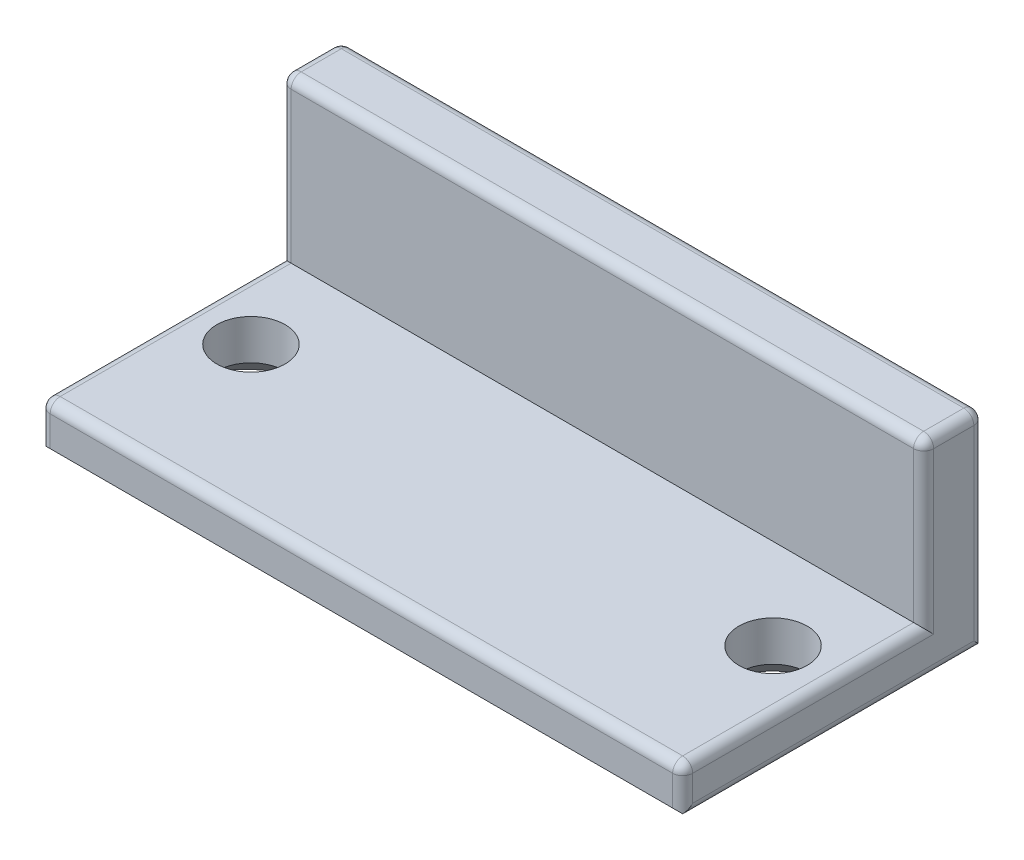
ISO-10303-21;
HEADER;
FILE_DESCRIPTION(('STEP AP214'),'2;1');
FILE_NAME('part.step','',(''),(''),'','','');
FILE_SCHEMA(('AUTOMOTIVE_DESIGN { 1 0 10303 214 1 1 1 1 }'));
ENDSEC;
DATA;
#1=APPLICATION_CONTEXT('core data for automotive mechanical design processes');
#2=APPLICATION_PROTOCOL_DEFINITION('international standard','automotive_design',2000,#1);
#3=PRODUCT_CONTEXT('',#1,'mechanical');
#4=PRODUCT('Part','Part','',(#3));
#5=PRODUCT_RELATED_PRODUCT_CATEGORY('part','',(#4));
#6=PRODUCT_DEFINITION_FORMATION('','',#4);
#7=PRODUCT_DEFINITION_CONTEXT('part definition',#1,'design');
#8=PRODUCT_DEFINITION('design','',#6,#7);
#9=PRODUCT_DEFINITION_SHAPE('','',#8);
#10=(LENGTH_UNIT() NAMED_UNIT(*) SI_UNIT(.MILLI.,.METRE.));
#11=(NAMED_UNIT(*) PLANE_ANGLE_UNIT() SI_UNIT($,.RADIAN.));
#12=(NAMED_UNIT(*) SI_UNIT($,.STERADIAN.) SOLID_ANGLE_UNIT());
#13=UNCERTAINTY_MEASURE_WITH_UNIT(LENGTH_MEASURE(1.E-05),#10,'distance_accuracy_value','');
#14=(GEOMETRIC_REPRESENTATION_CONTEXT(3) GLOBAL_UNCERTAINTY_ASSIGNED_CONTEXT((#13)) GLOBAL_UNIT_ASSIGNED_CONTEXT((#10,
#11,#12)) REPRESENTATION_CONTEXT('',''));
#15=CARTESIAN_POINT('',(0.,0.,0.));
#16=DIRECTION('',(0.,0.,1.));
#17=DIRECTION('',(1.,0.,0.));
#18=AXIS2_PLACEMENT_3D('',#15,#16,#17);
#19=CARTESIAN_POINT('',(0.,3.,0.));
#20=DIRECTION('',(0.,-1.,0.));
#21=DIRECTION('',(0.,0.,-1.));
#22=AXIS2_PLACEMENT_3D('',#19,#20,#21);
#23=PLANE('',#22);
#24=CARTESIAN_POINT('',(13.,3.,0.));
#25=DIRECTION('',(0.,-1.,0.));
#26=DIRECTION('',(0.,0.,-1.));
#27=AXIS2_PLACEMENT_3D('',#24,#25,#26);
#28=CIRCLE('',#27,1.7);
#29=CARTESIAN_POINT('',(13.,3.,-1.7));
#30=VERTEX_POINT('',#29);
#31=EDGE_CURVE('E544',#30,#30,#28,.T.);
#32=ORIENTED_EDGE('',*,*,#31,.T.);
#33=EDGE_LOOP('',(#32));
#34=FACE_BOUND('',#33,.T.);
#35=CARTESIAN_POINT('',(-13.,3.,0.));
#36=DIRECTION('',(0.,-1.,0.));
#37=DIRECTION('',(0.,0.,-1.));
#38=AXIS2_PLACEMENT_3D('',#35,#36,#37);
#39=CIRCLE('',#38,1.7);
#40=CARTESIAN_POINT('',(-13.,3.,-1.7));
#41=VERTEX_POINT('',#40);
#42=EDGE_CURVE('E311',#41,#41,#39,.T.);
#43=ORIENTED_EDGE('',*,*,#42,.T.);
#44=EDGE_LOOP('',(#43));
#45=FACE_BOUND('',#44,.T.);
#46=DIRECTION('',(0.,0.,1.));
#47=VECTOR('',#46,1.);
#48=CARTESIAN_POINT('',(-15.5,3.,0.));
#49=LINE('',#48,#47);
#50=CARTESIAN_POINT('',(-15.5,3.,-4.5));
#51=VERTEX_POINT('',#50);
#52=CARTESIAN_POINT('',(-15.5,3.,7.));
#53=VERTEX_POINT('',#52);
#54=EDGE_CURVE('E345',#51,#53,#49,.T.);
#55=ORIENTED_EDGE('',*,*,#54,.T.);
#56=DIRECTION('',(1.,0.,0.));
#57=VECTOR('',#56,1.);
#58=CARTESIAN_POINT('',(0.,3.,7.));
#59=LINE('',#58,#57);
#60=CARTESIAN_POINT('',(15.5,3.,7.));
#61=VERTEX_POINT('',#60);
#62=EDGE_CURVE('E52',#53,#61,#59,.T.);
#63=ORIENTED_EDGE('',*,*,#62,.T.);
#64=DIRECTION('',(0.,0.,-1.));
#65=VECTOR('',#64,1.);
#66=CARTESIAN_POINT('',(15.5,3.,0.));
#67=LINE('',#66,#65);
#68=CARTESIAN_POINT('',(15.5,3.,-4.5));
#69=VERTEX_POINT('',#68);
#70=EDGE_CURVE('E342',#61,#69,#67,.T.);
#71=ORIENTED_EDGE('',*,*,#70,.T.);
#72=DIRECTION('',(1.,0.,0.));
#73=VECTOR('',#72,1.);
#74=CARTESIAN_POINT('',(-16.,3.,-4.5));
#75=LINE('',#74,#73);
#76=EDGE_CURVE('E216',#51,#69,#75,.T.);
#77=ORIENTED_EDGE('',*,*,#76,.F.);
#78=EDGE_LOOP('',(#55,#63,#71,#77));
#79=FACE_BOUND('',#78,.T.);
#80=ADVANCED_FACE('F42',(#34,#45,#79),#23,.F.);
#81=CARTESIAN_POINT('',(16.,3.,7.5));
#82=DIRECTION('',(-1.,0.,0.));
#83=DIRECTION('',(0.,0.,1.));
#84=AXIS2_PLACEMENT_3D('',#81,#82,#83);
#85=PLANE('',#84);
#86=DIRECTION('',(0.,-1.,0.));
#87=VECTOR('',#86,1.);
#88=CARTESIAN_POINT('',(16.,3.,-5.));
#89=LINE('',#88,#87);
#90=CARTESIAN_POINT('',(16.,10.5,-5.));
#91=VERTEX_POINT('',#90);
#92=CARTESIAN_POINT('',(16.,2.5,-5.));
#93=VERTEX_POINT('',#92);
#94=EDGE_CURVE('E403',#91,#93,#89,.T.);
#95=ORIENTED_EDGE('',*,*,#94,.T.);
#96=DIRECTION('',(0.,0.,-1.));
#97=VECTOR('',#96,1.);
#98=CARTESIAN_POINT('',(16.,2.5,7.5));
#99=LINE('',#98,#97);
#100=CARTESIAN_POINT('',(16.,2.5,7.));
#101=VERTEX_POINT('',#100);
#102=EDGE_CURVE('E406',#93,#101,#99,.F.);
#103=ORIENTED_EDGE('',*,*,#102,.T.);
#104=DIRECTION('',(0.,-1.,0.));
#105=VECTOR('',#104,1.);
#106=CARTESIAN_POINT('',(16.,3.,7.));
#107=LINE('',#106,#105);
#108=CARTESIAN_POINT('',(16.,1.20710678118655,7.));
#109=VERTEX_POINT('',#108);
#110=EDGE_CURVE('E391',#101,#109,#107,.T.);
#111=ORIENTED_EDGE('',*,*,#110,.T.);
#112=DIRECTION('',(0.,0.,-1.));
#113=VECTOR('',#112,1.);
#114=CARTESIAN_POINT('',(16.,1.20710678118655,-7.5));
#115=LINE('',#114,#113);
#116=CARTESIAN_POINT('',(16.,1.20710678118655,-7.));
#117=VERTEX_POINT('',#116);
#118=EDGE_CURVE('E394',#109,#117,#115,.T.);
#119=ORIENTED_EDGE('',*,*,#118,.T.);
#120=DIRECTION('',(0.,-1.,0.));
#121=VECTOR('',#120,1.);
#122=CARTESIAN_POINT('',(16.,3.,-7.));
#123=LINE('',#122,#121);
#124=CARTESIAN_POINT('',(16.,10.5,-7.));
#125=VERTEX_POINT('',#124);
#126=EDGE_CURVE('E397',#117,#125,#123,.F.);
#127=ORIENTED_EDGE('',*,*,#126,.T.);
#128=DIRECTION('',(0.,0.,-1.));
#129=VECTOR('',#128,1.);
#130=CARTESIAN_POINT('',(16.,10.5,-4.5));
#131=LINE('',#130,#129);
#132=EDGE_CURVE('E400',#125,#91,#131,.F.);
#133=ORIENTED_EDGE('',*,*,#132,.T.);
#134=EDGE_LOOP('',(#95,#103,#111,#119,#127,#133));
#135=FACE_BOUND('',#134,.T.);
#136=ADVANCED_FACE('F518',(#135),#85,.F.);
#137=CARTESIAN_POINT('',(-16.,3.,-7.5));
#138=DIRECTION('',(0.,0.,1.));
#139=DIRECTION('',(1.,0.,0.));
#140=AXIS2_PLACEMENT_3D('',#137,#138,#139);
#141=PLANE('',#140);
#142=DIRECTION('',(-1.,0.,0.));
#143=VECTOR('',#142,1.);
#144=CARTESIAN_POINT('',(-16.,1.,-7.5));
#145=LINE('',#144,#143);
#146=CARTESIAN_POINT('',(15.5,1.,-7.5));
#147=VERTEX_POINT('',#146);
#148=CARTESIAN_POINT('',(-15.5,1.,-7.5));
#149=VERTEX_POINT('',#148);
#150=EDGE_CURVE('E212',#147,#149,#145,.T.);
#151=ORIENTED_EDGE('',*,*,#150,.T.);
#152=DIRECTION('',(0.,-1.,0.));
#153=VECTOR('',#152,1.);
#154=CARTESIAN_POINT('',(-15.5,3.,-7.5));
#155=LINE('',#154,#153);
#156=CARTESIAN_POINT('',(-15.5,10.5,-7.5));
#157=VERTEX_POINT('',#156);
#158=EDGE_CURVE('E375',#149,#157,#155,.F.);
#159=ORIENTED_EDGE('',*,*,#158,.T.);
#160=DIRECTION('',(-1.,0.,0.));
#161=VECTOR('',#160,1.);
#162=CARTESIAN_POINT('',(16.,10.5,-7.5));
#163=LINE('',#162,#161);
#164=CARTESIAN_POINT('',(15.5,10.5,-7.5));
#165=VERTEX_POINT('',#164);
#166=EDGE_CURVE('E372',#157,#165,#163,.F.);
#167=ORIENTED_EDGE('',*,*,#166,.T.);
#168=DIRECTION('',(0.,-1.,0.));
#169=VECTOR('',#168,1.);
#170=CARTESIAN_POINT('',(15.5,3.,-7.5));
#171=LINE('',#170,#169);
#172=EDGE_CURVE('E369',#165,#147,#171,.T.);
#173=ORIENTED_EDGE('',*,*,#172,.T.);
#174=EDGE_LOOP('',(#151,#159,#167,#173));
#175=FACE_BOUND('',#174,.T.);
#176=ADVANCED_FACE('F576',(#175),#141,.F.);
#177=CARTESIAN_POINT('',(-16.,3.,7.5));
#178=DIRECTION('',(1.,0.,0.));
#179=DIRECTION('',(0.,0.,-1.));
#180=AXIS2_PLACEMENT_3D('',#177,#178,#179);
#181=PLANE('',#180);
#182=DIRECTION('',(0.,0.,1.));
#183=VECTOR('',#182,1.);
#184=CARTESIAN_POINT('',(-16.,2.5,7.5));
#185=LINE('',#184,#183);
#186=CARTESIAN_POINT('',(-16.,2.5,7.));
#187=VERTEX_POINT('',#186);
#188=CARTESIAN_POINT('',(-16.,2.5,-5.));
#189=VERTEX_POINT('',#188);
#190=EDGE_CURVE('E335',#187,#189,#185,.F.);
#191=ORIENTED_EDGE('',*,*,#190,.T.);
#192=DIRECTION('',(0.,-1.,0.));
#193=VECTOR('',#192,1.);
#194=CARTESIAN_POINT('',(-16.,3.,-5.));
#195=LINE('',#194,#193);
#196=CARTESIAN_POINT('',(-16.,10.5,-5.));
#197=VERTEX_POINT('',#196);
#198=EDGE_CURVE('E338',#189,#197,#195,.F.);
#199=ORIENTED_EDGE('',*,*,#198,.T.);
#200=DIRECTION('',(0.,0.,1.));
#201=VECTOR('',#200,1.);
#202=CARTESIAN_POINT('',(-16.,10.5,-7.5));
#203=LINE('',#202,#201);
#204=CARTESIAN_POINT('',(-16.,10.5,-7.));
#205=VERTEX_POINT('',#204);
#206=EDGE_CURVE('E322',#197,#205,#203,.F.);
#207=ORIENTED_EDGE('',*,*,#206,.T.);
#208=DIRECTION('',(0.,-1.,0.));
#209=VECTOR('',#208,1.);
#210=CARTESIAN_POINT('',(-16.,3.,-7.));
#211=LINE('',#210,#209);
#212=CARTESIAN_POINT('',(-16.,1.20710678118655,-7.));
#213=VERTEX_POINT('',#212);
#214=EDGE_CURVE('E325',#205,#213,#211,.T.);
#215=ORIENTED_EDGE('',*,*,#214,.T.);
#216=DIRECTION('',(0.,0.,1.));
#217=VECTOR('',#216,1.);
#218=CARTESIAN_POINT('',(-16.,1.20710678118655,7.5));
#219=LINE('',#218,#217);
#220=CARTESIAN_POINT('',(-16.,1.20710678118655,7.));
#221=VERTEX_POINT('',#220);
#222=EDGE_CURVE('E328',#213,#221,#219,.T.);
#223=ORIENTED_EDGE('',*,*,#222,.T.);
#224=DIRECTION('',(0.,-1.,0.));
#225=VECTOR('',#224,1.);
#226=CARTESIAN_POINT('',(-16.,3.,7.));
#227=LINE('',#226,#225);
#228=EDGE_CURVE('E331',#221,#187,#227,.F.);
#229=ORIENTED_EDGE('',*,*,#228,.T.);
#230=EDGE_LOOP('',(#191,#199,#207,#215,#223,#229));
#231=FACE_BOUND('',#230,.T.);
#232=ADVANCED_FACE('F585',(#231),#181,.F.);
#233=CARTESIAN_POINT('',(-16.,3.,7.5));
#234=DIRECTION('',(0.,0.,-1.));
#235=DIRECTION('',(-1.,0.,0.));
#236=AXIS2_PLACEMENT_3D('',#233,#234,#235);
#237=PLANE('',#236);
#238=DIRECTION('',(0.,-1.,0.));
#239=VECTOR('',#238,1.);
#240=CARTESIAN_POINT('',(15.5,3.,7.5));
#241=LINE('',#240,#239);
#242=CARTESIAN_POINT('',(15.5,1.,7.5));
#243=VERTEX_POINT('',#242);
#244=CARTESIAN_POINT('',(15.5,2.5,7.5));
#245=VERTEX_POINT('',#244);
#246=EDGE_CURVE('E348',#243,#245,#241,.F.);
#247=ORIENTED_EDGE('',*,*,#246,.T.);
#248=DIRECTION('',(1.,0.,0.));
#249=VECTOR('',#248,1.);
#250=CARTESIAN_POINT('',(-16.,2.5,7.5));
#251=LINE('',#250,#249);
#252=CARTESIAN_POINT('',(-15.5,2.5,7.5));
#253=VERTEX_POINT('',#252);
#254=EDGE_CURVE('E11',#245,#253,#251,.F.);
#255=ORIENTED_EDGE('',*,*,#254,.T.);
#256=DIRECTION('',(0.,-1.,0.));
#257=VECTOR('',#256,1.);
#258=CARTESIAN_POINT('',(-15.5,3.,7.5));
#259=LINE('',#258,#257);
#260=CARTESIAN_POINT('',(-15.5,1.,7.5));
#261=VERTEX_POINT('',#260);
#262=EDGE_CURVE('E351',#253,#261,#259,.T.);
#263=ORIENTED_EDGE('',*,*,#262,.T.);
#264=DIRECTION('',(1.,0.,0.));
#265=VECTOR('',#264,1.);
#266=CARTESIAN_POINT('',(16.,1.,7.5));
#267=LINE('',#266,#265);
#268=EDGE_CURVE('E242',#261,#243,#267,.T.);
#269=ORIENTED_EDGE('',*,*,#268,.T.);
#270=EDGE_LOOP('',(#247,#255,#263,#269));
#271=FACE_BOUND('',#270,.T.);
#272=ADVANCED_FACE('F582',(#271),#237,.F.);
#273=CARTESIAN_POINT('',(0.,0.,0.));
#274=DIRECTION('',(0.,-1.,0.));
#275=DIRECTION('',(0.,0.,-1.));
#276=AXIS2_PLACEMENT_3D('',#273,#274,#275);
#277=PLANE('',#276);
#278=CARTESIAN_POINT('',(-13.,0.,0.));
#279=DIRECTION('',(0.,-1.,0.));
#280=DIRECTION('',(0.,0.,-1.));
#281=AXIS2_PLACEMENT_3D('',#278,#279,#280);
#282=CIRCLE('',#281,2.7);
#283=CARTESIAN_POINT('',(-15.,0.,1.8138357147217));
#284=VERTEX_POINT('',#283);
#285=CARTESIAN_POINT('',(-13.,0.,2.69999999999999));
#286=VERTEX_POINT('',#285);
#287=EDGE_CURVE('E233',#284,#286,#282,.F.);
#288=ORIENTED_EDGE('',*,*,#287,.T.);
#289=CARTESIAN_POINT('',(-13.,0.,0.));
#290=DIRECTION('',(0.,-1.,0.));
#291=DIRECTION('',(0.,0.,-1.));
#292=AXIS2_PLACEMENT_3D('',#289,#290,#291);
#293=CIRCLE('',#292,2.7);
#294=CARTESIAN_POINT('',(-15.,0.,-1.81383571472171));
#295=VERTEX_POINT('',#294);
#296=EDGE_CURVE('E239',#286,#295,#293,.F.);
#297=ORIENTED_EDGE('',*,*,#296,.T.);
#298=DIRECTION('',(0.,0.,-1.));
#299=VECTOR('',#298,1.);
#300=CARTESIAN_POINT('',(-15.,0.,-7.5));
#301=LINE('',#300,#299);
#302=CARTESIAN_POINT('',(-15.,0.,-6.5));
#303=VERTEX_POINT('',#302);
#304=EDGE_CURVE('E236',#295,#303,#301,.T.);
#305=ORIENTED_EDGE('',*,*,#304,.T.);
#306=DIRECTION('',(1.,0.,0.));
#307=VECTOR('',#306,1.);
#308=CARTESIAN_POINT('',(16.,0.,-6.5));
#309=LINE('',#308,#307);
#310=CARTESIAN_POINT('',(15.,0.,-6.5));
#311=VERTEX_POINT('',#310);
#312=EDGE_CURVE('E230',#303,#311,#309,.T.);
#313=ORIENTED_EDGE('',*,*,#312,.T.);
#314=DIRECTION('',(0.,0.,1.));
#315=VECTOR('',#314,1.);
#316=CARTESIAN_POINT('',(15.,0.,7.5));
#317=LINE('',#316,#315);
#318=CARTESIAN_POINT('',(15.,0.,-1.81383571472172));
#319=VERTEX_POINT('',#318);
#320=EDGE_CURVE('E202',#311,#319,#317,.T.);
#321=ORIENTED_EDGE('',*,*,#320,.T.);
#322=CARTESIAN_POINT('',(13.,0.,0.));
#323=DIRECTION('',(0.,-1.,0.));
#324=DIRECTION('',(0.,0.,-1.));
#325=AXIS2_PLACEMENT_3D('',#322,#323,#324);
#326=CIRCLE('',#325,2.7);
#327=CARTESIAN_POINT('',(13.,0.,-2.7));
#328=VERTEX_POINT('',#327);
#329=EDGE_CURVE('E194',#319,#328,#326,.F.);
#330=ORIENTED_EDGE('',*,*,#329,.T.);
#331=CARTESIAN_POINT('',(13.,0.,0.));
#332=DIRECTION('',(0.,-1.,0.));
#333=DIRECTION('',(0.,0.,-1.));
#334=AXIS2_PLACEMENT_3D('',#331,#332,#333);
#335=CIRCLE('',#334,2.7);
#336=CARTESIAN_POINT('',(15.,0.,1.81383571472172));
#337=VERTEX_POINT('',#336);
#338=EDGE_CURVE('E198',#328,#337,#335,.F.);
#339=ORIENTED_EDGE('',*,*,#338,.T.);
#340=DIRECTION('',(0.,0.,1.));
#341=VECTOR('',#340,1.);
#342=CARTESIAN_POINT('',(15.,0.,7.5));
#343=LINE('',#342,#341);
#344=CARTESIAN_POINT('',(15.,0.,6.5));
#345=VERTEX_POINT('',#344);
#346=EDGE_CURVE('E206',#337,#345,#343,.T.);
#347=ORIENTED_EDGE('',*,*,#346,.T.);
#348=DIRECTION('',(-1.,0.,0.));
#349=VECTOR('',#348,1.);
#350=CARTESIAN_POINT('',(-16.,0.,6.5));
#351=LINE('',#350,#349);
#352=CARTESIAN_POINT('',(-15.,0.,6.5));
#353=VERTEX_POINT('',#352);
#354=EDGE_CURVE('E224',#345,#353,#351,.T.);
#355=ORIENTED_EDGE('',*,*,#354,.T.);
#356=DIRECTION('',(0.,0.,-1.));
#357=VECTOR('',#356,1.);
#358=CARTESIAN_POINT('',(-15.,0.,-7.5));
#359=LINE('',#358,#357);
#360=EDGE_CURVE('E227',#353,#284,#359,.T.);
#361=ORIENTED_EDGE('',*,*,#360,.T.);
#362=EDGE_LOOP('',(#288,#297,#305,#313,#321,#330,#339,#347,#355,#361));
#363=FACE_BOUND('',#362,.T.);
#364=ADVANCED_FACE('F196',(#363),#277,.T.);
#365=CARTESIAN_POINT('',(-16.,11.,-4.5));
#366=DIRECTION('',(0.,0.,-1.));
#367=DIRECTION('',(-1.,0.,0.));
#368=AXIS2_PLACEMENT_3D('',#365,#366,#367);
#369=PLANE('',#368);
#370=DIRECTION('',(1.,0.,0.));
#371=VECTOR('',#370,1.);
#372=CARTESIAN_POINT('',(-16.,10.5,-4.5));
#373=LINE('',#372,#371);
#374=CARTESIAN_POINT('',(15.5,10.5,-4.5));
#375=VERTEX_POINT('',#374);
#376=CARTESIAN_POINT('',(-15.5,10.5,-4.5));
#377=VERTEX_POINT('',#376);
#378=EDGE_CURVE('E315',#375,#377,#373,.F.);
#379=ORIENTED_EDGE('',*,*,#378,.T.);
#380=DIRECTION('',(0.,-1.,0.));
#381=VECTOR('',#380,1.);
#382=CARTESIAN_POINT('',(-15.5,11.,-4.5));
#383=LINE('',#382,#381);
#384=EDGE_CURVE('E318',#377,#51,#383,.T.);
#385=ORIENTED_EDGE('',*,*,#384,.T.);
#386=ORIENTED_EDGE('',*,*,#76,.T.);
#387=DIRECTION('',(0.,-1.,0.));
#388=VECTOR('',#387,1.);
#389=CARTESIAN_POINT('',(15.5,11.,-4.5));
#390=LINE('',#389,#388);
#391=EDGE_CURVE('E254',#69,#375,#390,.F.);
#392=ORIENTED_EDGE('',*,*,#391,.T.);
#393=EDGE_LOOP('',(#379,#385,#386,#392));
#394=FACE_BOUND('',#393,.T.);
#395=ADVANCED_FACE('F539',(#394),#369,.F.);
#396=CARTESIAN_POINT('',(0.,11.,0.));
#397=DIRECTION('',(0.,1.,0.));
#398=DIRECTION('',(0.,0.,1.));
#399=AXIS2_PLACEMENT_3D('',#396,#397,#398);
#400=PLANE('',#399);
#401=DIRECTION('',(-1.,0.,0.));
#402=VECTOR('',#401,1.);
#403=CARTESIAN_POINT('',(-16.,11.,-7.));
#404=LINE('',#403,#402);
#405=CARTESIAN_POINT('',(15.5,11.,-7.));
#406=VERTEX_POINT('',#405);
#407=CARTESIAN_POINT('',(-15.5,11.,-7.));
#408=VERTEX_POINT('',#407);
#409=EDGE_CURVE('E384',#406,#408,#404,.T.);
#410=ORIENTED_EDGE('',*,*,#409,.T.);
#411=DIRECTION('',(0.,0.,1.));
#412=VECTOR('',#411,1.);
#413=CARTESIAN_POINT('',(-15.5,11.,-4.5));
#414=LINE('',#413,#412);
#415=CARTESIAN_POINT('',(-15.5,11.,-5.));
#416=VERTEX_POINT('',#415);
#417=EDGE_CURVE('E388',#408,#416,#414,.T.);
#418=ORIENTED_EDGE('',*,*,#417,.T.);
#419=DIRECTION('',(1.,0.,0.));
#420=VECTOR('',#419,1.);
#421=CARTESIAN_POINT('',(16.,11.,-5.));
#422=LINE('',#421,#420);
#423=CARTESIAN_POINT('',(15.5,11.,-5.));
#424=VERTEX_POINT('',#423);
#425=EDGE_CURVE('E381',#416,#424,#422,.T.);
#426=ORIENTED_EDGE('',*,*,#425,.T.);
#427=DIRECTION('',(0.,0.,-1.));
#428=VECTOR('',#427,1.);
#429=CARTESIAN_POINT('',(15.5,11.,-7.5));
#430=LINE('',#429,#428);
#431=EDGE_CURVE('E378',#424,#406,#430,.T.);
#432=ORIENTED_EDGE('',*,*,#431,.T.);
#433=EDGE_LOOP('',(#410,#418,#426,#432));
#434=FACE_BOUND('',#433,.T.);
#435=ADVANCED_FACE('F557',(#434),#400,.T.);
#436=CARTESIAN_POINT('',(-13.,8.,0.));
#437=DIRECTION('',(0.,-1.,0.));
#438=DIRECTION('',(0.,0.,-1.));
#439=AXIS2_PLACEMENT_3D('',#436,#437,#438);
#440=CYLINDRICAL_SURFACE('',#439,1.7);
#441=CARTESIAN_POINT('',(-13.,0.999999999999994,0.));
#442=DIRECTION('',(0.,-1.,0.));
#443=DIRECTION('',(0.,0.,-1.));
#444=AXIS2_PLACEMENT_3D('',#441,#442,#443);
#445=CIRCLE('',#444,1.7);
#446=CARTESIAN_POINT('',(-13.,0.999999999999994,-1.7));
#447=VERTEX_POINT('',#446);
#448=EDGE_CURVE('E246',#447,#447,#445,.T.);
#449=ORIENTED_EDGE('',*,*,#448,.T.);
#450=EDGE_LOOP('',(#449));
#451=FACE_BOUND('',#450,.T.);
#452=ORIENTED_EDGE('',*,*,#42,.F.);
#453=EDGE_LOOP('',(#452));
#454=FACE_BOUND('',#453,.T.);
#455=ADVANCED_FACE('F554',(#451,#454),#440,.F.);
#456=CARTESIAN_POINT('',(13.,8.,0.));
#457=DIRECTION('',(0.,-1.,0.));
#458=DIRECTION('',(0.,0.,-1.));
#459=AXIS2_PLACEMENT_3D('',#456,#457,#458);
#460=CYLINDRICAL_SURFACE('',#459,1.7);
#461=CARTESIAN_POINT('',(13.,1.,0.));
#462=DIRECTION('',(0.,-1.,0.));
#463=DIRECTION('',(0.,0.,-1.));
#464=AXIS2_PLACEMENT_3D('',#461,#462,#463);
#465=CIRCLE('',#464,1.7);
#466=CARTESIAN_POINT('',(13.,1.,-1.7));
#467=VERTEX_POINT('',#466);
#468=EDGE_CURVE('E250',#467,#467,#465,.T.);
#469=ORIENTED_EDGE('',*,*,#468,.T.);
#470=EDGE_LOOP('',(#469));
#471=FACE_BOUND('',#470,.T.);
#472=ORIENTED_EDGE('',*,*,#31,.F.);
#473=EDGE_LOOP('',(#472));
#474=FACE_BOUND('',#473,.T.);
#475=ADVANCED_FACE('F556',(#471,#474),#460,.F.);
#476=CARTESIAN_POINT('',(13.,1.,0.));
#477=DIRECTION('',(0.,-1.,0.));
#478=DIRECTION('',(0.,0.,-1.));
#479=AXIS2_PLACEMENT_3D('',#476,#477,#478);
#480=CONICAL_SURFACE('',#479,1.7,0.78539816339745);
#481=ORIENTED_EDGE('',*,*,#468,.F.);
#482=EDGE_LOOP('',(#481));
#483=FACE_BOUND('',#482,.T.);
#484=ORIENTED_EDGE('',*,*,#338,.F.);
#485=ORIENTED_EDGE('',*,*,#329,.F.);
#486=CARTESIAN_POINT('',(14.9998,-0.000200000000000547,1.81435387948439));
#487=CARTESIAN_POINT('',(15.0411629839994,0.0411629839994267,1.70724000411241));
#488=CARTESIAN_POINT('',(15.0797194354116,0.0797194354115823,1.59784142456773));
#489=CARTESIAN_POINT('',(15.1503017620014,0.150301762001411,1.37463252955475));
#490=CARTESIAN_POINT('',(15.1823128713285,0.182312871328483,1.26081291354627));
#491=CARTESIAN_POINT('',(15.2385325006363,0.238532500636299,1.03006191289377));
#492=CARTESIAN_POINT('',(15.2627845248234,0.262784524823366,0.913152004536866));
#493=CARTESIAN_POINT('',(15.3027946349242,0.302794634924207,0.676537219466107));
#494=CARTESIAN_POINT('',(15.3185601508184,0.318560150818436,0.556834883662898));
#495=CARTESIAN_POINT('',(15.3401079391833,0.340107939183312,0.324709318615479));
#496=CARTESIAN_POINT('',(15.3465465464665,0.34654654646653,0.212408292390065));
#497=CARTESIAN_POINT('',(15.3513291299428,0.351329129942794,-0.0125651475753164));
#498=CARTESIAN_POINT('',(15.3496716438017,0.349671643801728,-0.125237624734567));
#499=CARTESIAN_POINT('',(15.3383276058756,0.338327605875623,-0.349750907141734));
#500=CARTESIAN_POINT('',(15.3286416910462,0.328641691046184,-0.461591777657045));
#501=CARTESIAN_POINT('',(15.3016262547557,0.301626254755732,-0.683380981396836));
#502=CARTESIAN_POINT('',(15.2842981138881,0.284298113888065,-0.793329652727457));
#503=CARTESIAN_POINT('',(15.248206216726,0.248206216726016,-0.981425281303768));
#504=CARTESIAN_POINT('',(15.2310674409014,0.231067440901398,-1.06020911619925));
#505=CARTESIAN_POINT('',(15.1933101821728,0.193310182172809,-1.21612580761758));
#506=CARTESIAN_POINT('',(15.1726903128412,0.172690312841231,-1.29325799248525));
#507=CARTESIAN_POINT('',(15.1283170390574,0.128317039057426,-1.44554864405706));
#508=CARTESIAN_POINT('',(15.1045684536106,0.104568453610574,-1.52070993717246));
#509=CARTESIAN_POINT('',(15.0542367266415,0.0542367266414942,-1.66903340845876));
#510=CARTESIAN_POINT('',(15.0276560514457,0.0276560514457281,-1.74219725745951));
#511=CARTESIAN_POINT('',(14.9997999999999,-0.000200000000054542,-1.81435387948453));
#512=B_SPLINE_CURVE_WITH_KNOTS('',3,(#486,#487,#488,#489,#490,#491,#492,#493,#494,#495,#496,
#497,#498,#499,#500,#501,#502,#503,#504,#505,#506,#507,#508,#509,#510,#511),.UNSPECIFIED.,.F.,
.F.,(4,2,2,2,2,2,2,2,2,2,2,2,4),(0.,0.366207492605783,0.73323222500116,1.09816148727509,
1.46277073035541,1.80021249015763,2.13771520168251,2.47519113914288,2.81260613541857,
3.05973058717296,3.30695369527124,3.55380037515872,3.80043381884866),.UNSPECIFIED.);
#513=EDGE_CURVE('E209',#337,#319,#512,.T.);
#514=ORIENTED_EDGE('',*,*,#513,.F.);
#515=EDGE_LOOP('',(#484,#485,#514));
#516=FACE_BOUND('',#515,.T.);
#517=ADVANCED_FACE('F208',(#483,#516),#480,.F.);
#518=CARTESIAN_POINT('',(-16.,1.,7.5));
#519=DIRECTION('',(0.,-0.707106781186549,0.707106781186546));
#520=DIRECTION('',(-1.,0.,0.));
#521=AXIS2_PLACEMENT_3D('',#518,#519,#520);
#522=PLANE('',#521);
#523=ORIENTED_EDGE('',*,*,#268,.F.);
#524=CARTESIAN_POINT('',(-15.5,0.500000000000002,7.));
#525=DIRECTION('',(0.,-0.707106781186549,0.707106781186546));
#526=DIRECTION('',(0.,-0.707106781186546,-0.707106781186549));
#527=AXIS2_PLACEMENT_3D('',#524,#525,#526);
#528=ELLIPSE('',#527,0.707106781186546,0.5);
#529=CARTESIAN_POINT('',(-15.8535533905933,0.853553390593274,7.35355339059327));
#530=VERTEX_POINT('',#529);
#531=EDGE_CURVE('E357',#261,#530,#528,.T.);
#532=ORIENTED_EDGE('',*,*,#531,.T.);
#533=DIRECTION('',(0.577350269189626,-0.577350269189624,-0.577350269189626));
#534=VECTOR('',#533,1.);
#535=CARTESIAN_POINT('',(-16.,1.,7.5));
#536=LINE('',#535,#534);
#537=EDGE_CURVE('E273',#353,#530,#536,.F.);
#538=ORIENTED_EDGE('',*,*,#537,.F.);
#539=ORIENTED_EDGE('',*,*,#354,.F.);
#540=DIRECTION('',(-0.577350269189626,-0.577350269189624,-0.577350269189626));
#541=VECTOR('',#540,1.);
#542=CARTESIAN_POINT('',(16.,1.,7.5));
#543=LINE('',#542,#541);
#544=CARTESIAN_POINT('',(15.8535533905933,0.853553390593275,7.35355339059327));
#545=VERTEX_POINT('',#544);
#546=EDGE_CURVE('E312',#545,#345,#543,.T.);
#547=ORIENTED_EDGE('',*,*,#546,.F.);
#548=CARTESIAN_POINT('',(15.5,0.500000000000002,7.));
#549=DIRECTION('',(0.,-0.707106781186549,0.707106781186546));
#550=DIRECTION('',(0.,-0.707106781186546,-0.707106781186549));
#551=AXIS2_PLACEMENT_3D('',#548,#549,#550);
#552=ELLIPSE('',#551,0.707106781186546,0.5);
#553=EDGE_CURVE('E354',#545,#243,#552,.T.);
#554=ORIENTED_EDGE('',*,*,#553,.T.);
#555=EDGE_LOOP('',(#523,#532,#538,#539,#547,#554));
#556=FACE_BOUND('',#555,.T.);
#557=ADVANCED_FACE('F287',(#556),#522,.T.);
#558=CARTESIAN_POINT('',(-13.,0.999999999999994,0.));
#559=DIRECTION('',(0.,-1.,0.));
#560=DIRECTION('',(0.,0.,-1.));
#561=AXIS2_PLACEMENT_3D('',#558,#559,#560);
#562=CONICAL_SURFACE('',#561,1.7,0.78539816339745);
#563=ORIENTED_EDGE('',*,*,#448,.F.);
#564=EDGE_LOOP('',(#563));
#565=FACE_BOUND('',#564,.T.);
#566=ORIENTED_EDGE('',*,*,#296,.F.);
#567=ORIENTED_EDGE('',*,*,#287,.F.);
#568=CARTESIAN_POINT('',(-14.9997999999999,-0.000200000000054675,-1.81435387948452));
#569=CARTESIAN_POINT('',(-15.0411629839994,0.0411629839993763,-1.70724000411254));
#570=CARTESIAN_POINT('',(-15.0797194354115,0.0797194354115358,-1.59784142456785));
#571=CARTESIAN_POINT('',(-15.1503017620014,0.150301762001372,-1.37463252955487));
#572=CARTESIAN_POINT('',(-15.1823128713284,0.182312871328448,-1.26081291354638));
#573=CARTESIAN_POINT('',(-15.2385325006363,0.238532500636271,-1.03006191289388));
#574=CARTESIAN_POINT('',(-15.2627845248233,0.262784524823341,-0.913152004536969));
#575=CARTESIAN_POINT('',(-15.3027946349242,0.302794634924189,-0.676537219466201));
#576=CARTESIAN_POINT('',(-15.3185601508184,0.318560150818421,-0.556834883662988));
#577=CARTESIAN_POINT('',(-15.3401079391833,0.340107939183301,-0.32470931861556));
#578=CARTESIAN_POINT('',(-15.3465465464665,0.346546546466522,-0.212408292390143));
#579=CARTESIAN_POINT('',(-15.3513291299428,0.351329129942789,0.0125651475752446));
#580=CARTESIAN_POINT('',(-15.3496716438017,0.349671643801724,0.125237624734499));
#581=CARTESIAN_POINT('',(-15.3383276058756,0.338327605875622,0.349750907141673));
#582=CARTESIAN_POINT('',(-15.3286416910462,0.328641691046184,0.461591777656987));
#583=CARTESIAN_POINT('',(-15.3016262547557,0.301626254755733,0.683380981396784));
#584=CARTESIAN_POINT('',(-15.2842981138881,0.284298113888067,0.793329652727409));
#585=CARTESIAN_POINT('',(-15.248206216726,0.248206216726022,0.981425281303713));
#586=CARTESIAN_POINT('',(-15.2310674409014,0.231067440901407,1.06020911619919));
#587=CARTESIAN_POINT('',(-15.1933101821728,0.193310182172825,1.21612580761749));
#588=CARTESIAN_POINT('',(-15.1726903128412,0.172690312841251,1.29325799248515));
#589=CARTESIAN_POINT('',(-15.1283170390574,0.128317039057454,1.44554864405695));
#590=CARTESIAN_POINT('',(-15.1045684536106,0.104568453610607,1.52070993717234));
#591=CARTESIAN_POINT('',(-15.0542367266415,0.0542367266415375,1.66903340845862));
#592=CARTESIAN_POINT('',(-15.0276560514458,0.0276560514457766,1.74219725745936));
#593=CARTESIAN_POINT('',(-14.9998,-0.000200000000000576,1.81435387948437));
#594=B_SPLINE_CURVE_WITH_KNOTS('',3,(#568,#569,#570,#571,#572,#573,#574,#575,#576,#577,#578,
#579,#580,#581,#582,#583,#584,#585,#586,#587,#588,#589,#590,#591,#592,#593),.UNSPECIFIED.,.F.,
.F.,(4,2,2,2,2,2,2,2,2,2,2,2,4),(0.,0.366207492605798,0.733232225001189,1.09816148727513,
1.46277073035547,1.8002124901577,2.13771520168259,2.47519113914297,2.81260613541867,
3.05973058717302,3.30695369527128,3.55380037515872,3.80043381884863),.UNSPECIFIED.);
#595=EDGE_CURVE('E263',#295,#284,#594,.T.);
#596=ORIENTED_EDGE('',*,*,#595,.F.);
#597=EDGE_LOOP('',(#566,#567,#596));
#598=FACE_BOUND('',#597,.T.);
#599=ADVANCED_FACE('F279',(#565,#598),#562,.F.);
#600=CARTESIAN_POINT('',(16.,1.,7.5));
#601=DIRECTION('',(0.707106781186546,-0.707106781186549,0.));
#602=DIRECTION('',(0.,0.,1.));
#603=AXIS2_PLACEMENT_3D('',#600,#601,#602);
#604=PLANE('',#603);
#605=DIRECTION('',(0.577350269189626,0.577350269189624,-0.577350269189626));
#606=VECTOR('',#605,1.);
#607=CARTESIAN_POINT('',(11.,-3.99999999999999,-2.49999999999999));
#608=LINE('',#607,#606);
#609=CARTESIAN_POINT('',(15.8535533905933,0.853553390593274,-7.35355339059327));
#610=VERTEX_POINT('',#609);
#611=EDGE_CURVE('E259',#610,#311,#608,.F.);
#612=ORIENTED_EDGE('',*,*,#611,.F.);
#613=DIRECTION('',(0.,0.,-1.));
#614=VECTOR('',#613,1.);
#615=CARTESIAN_POINT('',(15.8535533905933,0.853553390593274,7.5));
#616=LINE('',#615,#614);
#617=EDGE_CURVE('E410',#610,#545,#616,.F.);
#618=ORIENTED_EDGE('',*,*,#617,.T.);
#619=ORIENTED_EDGE('',*,*,#546,.T.);
#620=ORIENTED_EDGE('',*,*,#346,.F.);
#621=ORIENTED_EDGE('',*,*,#513,.T.);
#622=ORIENTED_EDGE('',*,*,#320,.F.);
#623=EDGE_LOOP('',(#612,#618,#619,#620,#621,#622));
#624=FACE_BOUND('',#623,.T.);
#625=ADVANCED_FACE('F286',(#624),#604,.T.);
#626=CARTESIAN_POINT('',(-16.,1.,7.5));
#627=DIRECTION('',(-0.707106781186546,-0.707106781186549,0.));
#628=DIRECTION('',(0.,0.,-1.));
#629=AXIS2_PLACEMENT_3D('',#626,#627,#628);
#630=PLANE('',#629);
#631=ORIENTED_EDGE('',*,*,#537,.T.);
#632=DIRECTION('',(0.,0.,1.));
#633=VECTOR('',#632,1.);
#634=CARTESIAN_POINT('',(-15.8535533905933,0.853553390593274,-7.5));
#635=LINE('',#634,#633);
#636=CARTESIAN_POINT('',(-15.8535533905933,0.853553390593274,-7.35355339059327));
#637=VERTEX_POINT('',#636);
#638=EDGE_CURVE('E360',#530,#637,#635,.F.);
#639=ORIENTED_EDGE('',*,*,#638,.T.);
#640=DIRECTION('',(0.577350269189626,-0.577350269189624,0.577350269189626));
#641=VECTOR('',#640,1.);
#642=CARTESIAN_POINT('',(-11.,-3.99999999999999,-2.49999999999999));
#643=LINE('',#642,#641);
#644=EDGE_CURVE('E255',#303,#637,#643,.F.);
#645=ORIENTED_EDGE('',*,*,#644,.F.);
#646=ORIENTED_EDGE('',*,*,#304,.F.);
#647=ORIENTED_EDGE('',*,*,#595,.T.);
#648=ORIENTED_EDGE('',*,*,#360,.F.);
#649=EDGE_LOOP('',(#631,#639,#645,#646,#647,#648));
#650=FACE_BOUND('',#649,.T.);
#651=ADVANCED_FACE('F289',(#650),#630,.T.);
#652=CARTESIAN_POINT('',(-16.,1.,-7.5));
#653=DIRECTION('',(0.,-0.707106781186549,-0.707106781186546));
#654=DIRECTION('',(1.,0.,0.));
#655=AXIS2_PLACEMENT_3D('',#652,#653,#654);
#656=PLANE('',#655);
#657=ORIENTED_EDGE('',*,*,#644,.T.);
#658=CARTESIAN_POINT('',(-15.5,0.500000000000002,-7.));
#659=DIRECTION('',(0.,-0.707106781186549,-0.707106781186546));
#660=DIRECTION('',(0.,-0.707106781186546,0.707106781186549));
#661=AXIS2_PLACEMENT_3D('',#658,#659,#660);
#662=ELLIPSE('',#661,0.707106781186546,0.5);
#663=EDGE_CURVE('E366',#637,#149,#662,.T.);
#664=ORIENTED_EDGE('',*,*,#663,.T.);
#665=ORIENTED_EDGE('',*,*,#150,.F.);
#666=CARTESIAN_POINT('',(15.5,0.500000000000002,-7.));
#667=DIRECTION('',(0.,-0.707106781186549,-0.707106781186546));
#668=DIRECTION('',(0.,-0.707106781186546,0.707106781186549));
#669=AXIS2_PLACEMENT_3D('',#666,#667,#668);
#670=ELLIPSE('',#669,0.707106781186546,0.5);
#671=EDGE_CURVE('E363',#147,#610,#670,.T.);
#672=ORIENTED_EDGE('',*,*,#671,.T.);
#673=ORIENTED_EDGE('',*,*,#611,.T.);
#674=ORIENTED_EDGE('',*,*,#312,.F.);
#675=EDGE_LOOP('',(#657,#664,#665,#672,#673,#674));
#676=FACE_BOUND('',#675,.T.);
#677=ADVANCED_FACE('F295',(#676),#656,.T.);
#678=CARTESIAN_POINT('',(15.5,1.20710678118655,7.5));
#679=DIRECTION('',(0.,0.,1.));
#680=DIRECTION('',(1.,0.,0.));
#681=AXIS2_PLACEMENT_3D('',#678,#679,#680);
#682=CYLINDRICAL_SURFACE('',#681,0.5);
#683=CARTESIAN_POINT('',(15.5,1.20710678118655,7.));
#684=DIRECTION('',(0.,-0.707106781186547,-0.707106781186547));
#685=DIRECTION('',(0.,-0.707106781186547,0.707106781186547));
#686=AXIS2_PLACEMENT_3D('',#683,#684,#685);
#687=ELLIPSE('',#686,0.707106781186547,0.5);
#688=EDGE_CURVE('E476',#545,#109,#687,.F.);
#689=ORIENTED_EDGE('',*,*,#688,.F.);
#690=ORIENTED_EDGE('',*,*,#617,.F.);
#691=CARTESIAN_POINT('',(15.5,1.20710678118655,-7.));
#692=DIRECTION('',(0.,-0.707106781186547,0.707106781186547));
#693=DIRECTION('',(0.,0.707106781186547,0.707106781186547));
#694=AXIS2_PLACEMENT_3D('',#691,#692,#693);
#695=ELLIPSE('',#694,0.707106781186547,0.5);
#696=EDGE_CURVE('E260',#117,#610,#695,.F.);
#697=ORIENTED_EDGE('',*,*,#696,.F.);
#698=ORIENTED_EDGE('',*,*,#118,.F.);
#699=EDGE_LOOP('',(#689,#690,#697,#698));
#700=FACE_BOUND('',#699,.T.);
#701=ADVANCED_FACE('F596',(#700),#682,.T.);
#702=CARTESIAN_POINT('',(15.5,3.,-7.));
#703=DIRECTION('',(0.,-1.,0.));
#704=DIRECTION('',(0.,0.,-1.));
#705=AXIS2_PLACEMENT_3D('',#702,#703,#704);
#706=CYLINDRICAL_SURFACE('',#705,0.5);
#707=ORIENTED_EDGE('',*,*,#671,.F.);
#708=ORIENTED_EDGE('',*,*,#172,.F.);
#709=CARTESIAN_POINT('',(15.5,10.5,-7.));
#710=DIRECTION('',(0.,1.,0.));
#711=DIRECTION('',(0.,0.,1.));
#712=AXIS2_PLACEMENT_3D('',#709,#710,#711);
#713=CIRCLE('',#712,0.5);
#714=EDGE_CURVE('E472',#125,#165,#713,.T.);
#715=ORIENTED_EDGE('',*,*,#714,.F.);
#716=ORIENTED_EDGE('',*,*,#126,.F.);
#717=ORIENTED_EDGE('',*,*,#696,.T.);
#718=EDGE_LOOP('',(#707,#708,#715,#716,#717));
#719=FACE_BOUND('',#718,.T.);
#720=ADVANCED_FACE('F602',(#719),#706,.T.);
#721=CARTESIAN_POINT('',(15.5,3.,7.));
#722=DIRECTION('',(0.,-1.,0.));
#723=DIRECTION('',(0.,0.,-1.));
#724=AXIS2_PLACEMENT_3D('',#721,#722,#723);
#725=CYLINDRICAL_SURFACE('',#724,0.5);
#726=ORIENTED_EDGE('',*,*,#110,.F.);
#727=CARTESIAN_POINT('',(15.5,2.5,7.));
#728=DIRECTION('',(0.,-1.,0.));
#729=DIRECTION('',(0.,0.,-1.));
#730=AXIS2_PLACEMENT_3D('',#727,#728,#729);
#731=CIRCLE('',#730,0.5);
#732=EDGE_CURVE('E60',#101,#245,#731,.T.);
#733=ORIENTED_EDGE('',*,*,#732,.T.);
#734=ORIENTED_EDGE('',*,*,#246,.F.);
#735=ORIENTED_EDGE('',*,*,#553,.F.);
#736=ORIENTED_EDGE('',*,*,#688,.T.);
#737=EDGE_LOOP('',(#726,#733,#734,#735,#736));
#738=FACE_BOUND('',#737,.T.);
#739=ADVANCED_FACE('F513',(#738),#725,.T.);
#740=CARTESIAN_POINT('',(15.5,10.5,-7.));
#741=DIRECTION('',(0.,0.,-1.));
#742=DIRECTION('',(-1.,0.,0.));
#743=AXIS2_PLACEMENT_3D('',#740,#741,#742);
#744=SPHERICAL_SURFACE('',#743,0.5);
#745=CARTESIAN_POINT('',(15.5,10.5,-7.));
#746=DIRECTION('',(0.,0.,-1.));
#747=DIRECTION('',(-1.,0.,0.));
#748=AXIS2_PLACEMENT_3D('',#745,#746,#747);
#749=CIRCLE('',#748,0.5);
#750=EDGE_CURVE('E464',#125,#406,#749,.F.);
#751=ORIENTED_EDGE('',*,*,#750,.F.);
#752=ORIENTED_EDGE('',*,*,#714,.T.);
#753=CARTESIAN_POINT('',(15.5,10.5,-7.));
#754=DIRECTION('',(1.,0.,0.));
#755=DIRECTION('',(0.,0.,-1.));
#756=AXIS2_PLACEMENT_3D('',#753,#754,#755);
#757=CIRCLE('',#756,0.5);
#758=EDGE_CURVE('E468',#406,#165,#757,.F.);
#759=ORIENTED_EDGE('',*,*,#758,.F.);
#760=EDGE_LOOP('',(#751,#752,#759));
#761=FACE_BOUND('',#760,.T.);
#762=ADVANCED_FACE('F643',(#761),#744,.T.);
#763=CARTESIAN_POINT('',(15.5,2.5,0.));
#764=DIRECTION('',(0.,0.,-1.));
#765=DIRECTION('',(-1.,0.,0.));
#766=AXIS2_PLACEMENT_3D('',#763,#764,#765);
#767=CYLINDRICAL_SURFACE('',#766,0.5);
#768=ORIENTED_EDGE('',*,*,#70,.F.);
#769=CARTESIAN_POINT('',(15.5,2.5,7.));
#770=DIRECTION('',(0.,0.,-1.));
#771=DIRECTION('',(-1.,0.,0.));
#772=AXIS2_PLACEMENT_3D('',#769,#770,#771);
#773=CIRCLE('',#772,0.5);
#774=EDGE_CURVE('E489',#61,#101,#773,.T.);
#775=ORIENTED_EDGE('',*,*,#774,.T.);
#776=ORIENTED_EDGE('',*,*,#102,.F.);
#777=CARTESIAN_POINT('',(15.5,2.5,-5.));
#778=DIRECTION('',(0.,0.707106781186547,-0.707106781186547));
#779=DIRECTION('',(0.,-0.707106781186547,-0.707106781186547));
#780=AXIS2_PLACEMENT_3D('',#777,#778,#779);
#781=ELLIPSE('',#780,0.707106781186547,0.5);
#782=EDGE_CURVE('E460',#69,#93,#781,.T.);
#783=ORIENTED_EDGE('',*,*,#782,.F.);
#784=EDGE_LOOP('',(#768,#775,#776,#783));
#785=FACE_BOUND('',#784,.T.);
#786=ADVANCED_FACE('F511',(#785),#767,.T.);
#787=CARTESIAN_POINT('',(0.,10.5,-7.));
#788=DIRECTION('',(1.,0.,0.));
#789=DIRECTION('',(0.,0.,-1.));
#790=AXIS2_PLACEMENT_3D('',#787,#788,#789);
#791=CYLINDRICAL_SURFACE('',#790,0.5);
#792=ORIENTED_EDGE('',*,*,#758,.T.);
#793=ORIENTED_EDGE('',*,*,#166,.F.);
#794=CARTESIAN_POINT('',(-15.5,10.5,-7.));
#795=DIRECTION('',(-1.,0.,0.));
#796=DIRECTION('',(0.,0.,1.));
#797=AXIS2_PLACEMENT_3D('',#794,#795,#796);
#798=CIRCLE('',#797,0.5);
#799=EDGE_CURVE('E452',#408,#157,#798,.T.);
#800=ORIENTED_EDGE('',*,*,#799,.F.);
#801=ORIENTED_EDGE('',*,*,#409,.F.);
#802=EDGE_LOOP('',(#792,#793,#800,#801));
#803=FACE_BOUND('',#802,.T.);
#804=ADVANCED_FACE('F633',(#803),#791,.T.);
#805=CARTESIAN_POINT('',(15.5,10.5,0.));
#806=DIRECTION('',(0.,0.,1.));
#807=DIRECTION('',(1.,0.,0.));
#808=AXIS2_PLACEMENT_3D('',#805,#806,#807);
#809=CYLINDRICAL_SURFACE('',#808,0.5);
#810=ORIENTED_EDGE('',*,*,#750,.T.);
#811=ORIENTED_EDGE('',*,*,#431,.F.);
#812=CARTESIAN_POINT('',(15.5,10.5,-5.));
#813=DIRECTION('',(0.,0.,1.));
#814=DIRECTION('',(1.,0.,0.));
#815=AXIS2_PLACEMENT_3D('',#812,#813,#814);
#816=CIRCLE('',#815,0.5);
#817=EDGE_CURVE('E448',#91,#424,#816,.T.);
#818=ORIENTED_EDGE('',*,*,#817,.F.);
#819=ORIENTED_EDGE('',*,*,#132,.F.);
#820=EDGE_LOOP('',(#810,#811,#818,#819));
#821=FACE_BOUND('',#820,.T.);
#822=ADVANCED_FACE('F529',(#821),#809,.T.);
#823=CARTESIAN_POINT('',(15.5,3.,-5.));
#824=DIRECTION('',(0.,-1.,0.));
#825=DIRECTION('',(0.,0.,-1.));
#826=AXIS2_PLACEMENT_3D('',#823,#824,#825);
#827=CYLINDRICAL_SURFACE('',#826,0.5);
#828=ORIENTED_EDGE('',*,*,#782,.T.);
#829=ORIENTED_EDGE('',*,*,#94,.F.);
#830=CARTESIAN_POINT('',(15.5,10.5,-5.));
#831=DIRECTION('',(0.,1.,0.));
#832=DIRECTION('',(0.,0.,1.));
#833=AXIS2_PLACEMENT_3D('',#830,#831,#832);
#834=CIRCLE('',#833,0.5);
#835=EDGE_CURVE('E444',#375,#91,#834,.T.);
#836=ORIENTED_EDGE('',*,*,#835,.F.);
#837=ORIENTED_EDGE('',*,*,#391,.F.);
#838=EDGE_LOOP('',(#828,#829,#836,#837));
#839=FACE_BOUND('',#838,.T.);
#840=ADVANCED_FACE('F524',(#839),#827,.T.);
#841=CARTESIAN_POINT('',(-15.5,3.,-7.));
#842=DIRECTION('',(0.,-1.,0.));
#843=DIRECTION('',(0.,0.,-1.));
#844=AXIS2_PLACEMENT_3D('',#841,#842,#843);
#845=CYLINDRICAL_SURFACE('',#844,0.5);
#846=CARTESIAN_POINT('',(-15.5,10.5,-7.));
#847=DIRECTION('',(0.,1.,0.));
#848=DIRECTION('',(0.,0.,1.));
#849=AXIS2_PLACEMENT_3D('',#846,#847,#848);
#850=CIRCLE('',#849,0.5);
#851=EDGE_CURVE('E456',#157,#205,#850,.T.);
#852=ORIENTED_EDGE('',*,*,#851,.F.);
#853=ORIENTED_EDGE('',*,*,#158,.F.);
#854=ORIENTED_EDGE('',*,*,#663,.F.);
#855=CARTESIAN_POINT('',(-15.5,1.20710678118655,-7.));
#856=DIRECTION('',(0.,-0.707106781186547,0.707106781186547));
#857=DIRECTION('',(0.,-0.707106781186547,-0.707106781186547));
#858=AXIS2_PLACEMENT_3D('',#855,#856,#857);
#859=ELLIPSE('',#858,0.707106781186547,0.5);
#860=EDGE_CURVE('E440',#213,#637,#859,.T.);
#861=ORIENTED_EDGE('',*,*,#860,.F.);
#862=ORIENTED_EDGE('',*,*,#214,.F.);
#863=EDGE_LOOP('',(#852,#853,#854,#861,#862));
#864=FACE_BOUND('',#863,.T.);
#865=ADVANCED_FACE('F614',(#864),#845,.T.);
#866=CARTESIAN_POINT('',(-15.5,10.5,-7.));
#867=DIRECTION('',(0.,0.,-1.));
#868=DIRECTION('',(-1.,0.,0.));
#869=AXIS2_PLACEMENT_3D('',#866,#867,#868);
#870=SPHERICAL_SURFACE('',#869,0.5);
#871=ORIENTED_EDGE('',*,*,#799,.T.);
#872=ORIENTED_EDGE('',*,*,#851,.T.);
#873=CARTESIAN_POINT('',(-15.5,10.5,-7.));
#874=DIRECTION('',(0.,0.,-1.));
#875=DIRECTION('',(-1.,0.,0.));
#876=AXIS2_PLACEMENT_3D('',#873,#874,#875);
#877=CIRCLE('',#876,0.5);
#878=EDGE_CURVE('E436',#408,#205,#877,.F.);
#879=ORIENTED_EDGE('',*,*,#878,.F.);
#880=EDGE_LOOP('',(#871,#872,#879));
#881=FACE_BOUND('',#880,.T.);
#882=ADVANCED_FACE('F626',(#881),#870,.T.);
#883=CARTESIAN_POINT('',(15.5,10.5,-5.));
#884=DIRECTION('',(1.,0.,0.));
#885=DIRECTION('',(0.,0.,-1.));
#886=AXIS2_PLACEMENT_3D('',#883,#884,#885);
#887=SPHERICAL_SURFACE('',#886,0.5);
#888=ORIENTED_EDGE('',*,*,#835,.T.);
#889=ORIENTED_EDGE('',*,*,#817,.T.);
#890=CARTESIAN_POINT('',(15.5,10.5,-5.));
#891=DIRECTION('',(1.,0.,0.));
#892=DIRECTION('',(0.,0.,-1.));
#893=AXIS2_PLACEMENT_3D('',#890,#891,#892);
#894=CIRCLE('',#893,0.5);
#895=EDGE_CURVE('E432',#375,#424,#894,.F.);
#896=ORIENTED_EDGE('',*,*,#895,.F.);
#897=EDGE_LOOP('',(#888,#889,#896));
#898=FACE_BOUND('',#897,.T.);
#899=ADVANCED_FACE('F531',(#898),#887,.T.);
#900=CARTESIAN_POINT('',(-15.5,1.20710678118655,7.5));
#901=DIRECTION('',(0.,0.,-1.));
#902=DIRECTION('',(-1.,0.,0.));
#903=AXIS2_PLACEMENT_3D('',#900,#901,#902);
#904=CYLINDRICAL_SURFACE('',#903,0.5);
#905=ORIENTED_EDGE('',*,*,#860,.T.);
#906=ORIENTED_EDGE('',*,*,#638,.F.);
#907=CARTESIAN_POINT('',(-15.5,1.20710678118655,7.));
#908=DIRECTION('',(0.,-0.707106781186547,-0.707106781186547));
#909=DIRECTION('',(0.,0.707106781186547,-0.707106781186547));
#910=AXIS2_PLACEMENT_3D('',#907,#908,#909);
#911=ELLIPSE('',#910,0.707106781186547,0.5);
#912=EDGE_CURVE('E428',#221,#530,#911,.F.);
#913=ORIENTED_EDGE('',*,*,#912,.F.);
#914=ORIENTED_EDGE('',*,*,#222,.F.);
#915=EDGE_LOOP('',(#905,#906,#913,#914));
#916=FACE_BOUND('',#915,.T.);
#917=ADVANCED_FACE('F619',(#916),#904,.T.);
#918=CARTESIAN_POINT('',(-15.5,10.5,0.));
#919=DIRECTION('',(0.,0.,-1.));
#920=DIRECTION('',(-1.,0.,0.));
#921=AXIS2_PLACEMENT_3D('',#918,#919,#920);
#922=CYLINDRICAL_SURFACE('',#921,0.5);
#923=ORIENTED_EDGE('',*,*,#878,.T.);
#924=ORIENTED_EDGE('',*,*,#206,.F.);
#925=CARTESIAN_POINT('',(-15.5,10.5,-5.));
#926=DIRECTION('',(0.,0.,1.));
#927=DIRECTION('',(1.,0.,0.));
#928=AXIS2_PLACEMENT_3D('',#925,#926,#927);
#929=CIRCLE('',#928,0.5);
#930=EDGE_CURVE('E424',#416,#197,#929,.T.);
#931=ORIENTED_EDGE('',*,*,#930,.F.);
#932=ORIENTED_EDGE('',*,*,#417,.F.);
#933=EDGE_LOOP('',(#923,#924,#931,#932));
#934=FACE_BOUND('',#933,.T.);
#935=ADVANCED_FACE('F629',(#934),#922,.T.);
#936=CARTESIAN_POINT('',(0.,10.5,-5.));
#937=DIRECTION('',(-1.,0.,0.));
#938=DIRECTION('',(0.,0.,1.));
#939=AXIS2_PLACEMENT_3D('',#936,#937,#938);
#940=CYLINDRICAL_SURFACE('',#939,0.5);
#941=ORIENTED_EDGE('',*,*,#895,.T.);
#942=ORIENTED_EDGE('',*,*,#425,.F.);
#943=CARTESIAN_POINT('',(-15.5,10.5,-5.));
#944=DIRECTION('',(-1.,0.,0.));
#945=DIRECTION('',(0.,0.,1.));
#946=AXIS2_PLACEMENT_3D('',#943,#944,#945);
#947=CIRCLE('',#946,0.5);
#948=EDGE_CURVE('E420',#377,#416,#947,.T.);
#949=ORIENTED_EDGE('',*,*,#948,.F.);
#950=ORIENTED_EDGE('',*,*,#378,.F.);
#951=EDGE_LOOP('',(#941,#942,#949,#950));
#952=FACE_BOUND('',#951,.T.);
#953=ADVANCED_FACE('F536',(#952),#940,.T.);
#954=CARTESIAN_POINT('',(-15.5,3.,7.));
#955=DIRECTION('',(0.,-1.,0.));
#956=DIRECTION('',(0.,0.,-1.));
#957=AXIS2_PLACEMENT_3D('',#954,#955,#956);
#958=CYLINDRICAL_SURFACE('',#957,0.5);
#959=ORIENTED_EDGE('',*,*,#262,.F.);
#960=CARTESIAN_POINT('',(-15.5,2.5,7.));
#961=DIRECTION('',(0.,-1.,0.));
#962=DIRECTION('',(0.,0.,-1.));
#963=AXIS2_PLACEMENT_3D('',#960,#961,#962);
#964=CIRCLE('',#963,0.5);
#965=EDGE_CURVE('E486',#253,#187,#964,.T.);
#966=ORIENTED_EDGE('',*,*,#965,.T.);
#967=ORIENTED_EDGE('',*,*,#228,.F.);
#968=ORIENTED_EDGE('',*,*,#912,.T.);
#969=ORIENTED_EDGE('',*,*,#531,.F.);
#970=EDGE_LOOP('',(#959,#966,#967,#968,#969));
#971=FACE_BOUND('',#970,.T.);
#972=ADVANCED_FACE('F679',(#971),#958,.T.);
#973=CARTESIAN_POINT('',(-15.5,10.5,-5.));
#974=DIRECTION('',(0.,1.,0.));
#975=DIRECTION('',(0.,0.,1.));
#976=AXIS2_PLACEMENT_3D('',#973,#974,#975);
#977=SPHERICAL_SURFACE('',#976,0.5);
#978=ORIENTED_EDGE('',*,*,#948,.T.);
#979=ORIENTED_EDGE('',*,*,#930,.T.);
#980=CARTESIAN_POINT('',(-15.5,10.5,-5.));
#981=DIRECTION('',(0.,1.,0.));
#982=DIRECTION('',(0.,0.,1.));
#983=AXIS2_PLACEMENT_3D('',#980,#981,#982);
#984=CIRCLE('',#983,0.5);
#985=EDGE_CURVE('E417',#377,#197,#984,.F.);
#986=ORIENTED_EDGE('',*,*,#985,.F.);
#987=EDGE_LOOP('',(#978,#979,#986));
#988=FACE_BOUND('',#987,.T.);
#989=ADVANCED_FACE('F671',(#988),#977,.T.);
#990=CARTESIAN_POINT('',(-15.5,2.5,0.));
#991=DIRECTION('',(0.,0.,1.));
#992=DIRECTION('',(1.,0.,0.));
#993=AXIS2_PLACEMENT_3D('',#990,#991,#992);
#994=CYLINDRICAL_SURFACE('',#993,0.5);
#995=ORIENTED_EDGE('',*,*,#190,.F.);
#996=CARTESIAN_POINT('',(-15.5,2.5,7.));
#997=DIRECTION('',(0.,0.,1.));
#998=DIRECTION('',(1.,0.,0.));
#999=AXIS2_PLACEMENT_3D('',#996,#997,#998);
#1000=CIRCLE('',#999,0.5);
#1001=EDGE_CURVE('E413',#187,#53,#1000,.F.);
#1002=ORIENTED_EDGE('',*,*,#1001,.T.);
#1003=ORIENTED_EDGE('',*,*,#54,.F.);
#1004=CARTESIAN_POINT('',(-15.5,2.5,-5.));
#1005=DIRECTION('',(0.,-0.707106781186547,0.707106781186547));
#1006=DIRECTION('',(0.,-0.707106781186547,-0.707106781186547));
#1007=AXIS2_PLACEMENT_3D('',#1004,#1005,#1006);
#1008=ELLIPSE('',#1007,0.707106781186547,0.5);
#1009=EDGE_CURVE('E414',#189,#51,#1008,.F.);
#1010=ORIENTED_EDGE('',*,*,#1009,.F.);
#1011=EDGE_LOOP('',(#995,#1002,#1003,#1010));
#1012=FACE_BOUND('',#1011,.T.);
#1013=ADVANCED_FACE('F666',(#1012),#994,.T.);
#1014=CARTESIAN_POINT('',(-15.5,11.,-5.));
#1015=DIRECTION('',(0.,-1.,0.));
#1016=DIRECTION('',(0.,0.,-1.));
#1017=AXIS2_PLACEMENT_3D('',#1014,#1015,#1016);
#1018=CYLINDRICAL_SURFACE('',#1017,0.5);
#1019=ORIENTED_EDGE('',*,*,#985,.T.);
#1020=ORIENTED_EDGE('',*,*,#198,.F.);
#1021=ORIENTED_EDGE('',*,*,#1009,.T.);
#1022=ORIENTED_EDGE('',*,*,#384,.F.);
#1023=EDGE_LOOP('',(#1019,#1020,#1021,#1022));
#1024=FACE_BOUND('',#1023,.T.);
#1025=ADVANCED_FACE('F662',(#1024),#1018,.T.);
#1026=CARTESIAN_POINT('',(15.5,2.5,7.));
#1027=DIRECTION('',(0.,0.,1.));
#1028=DIRECTION('',(1.,0.,0.));
#1029=AXIS2_PLACEMENT_3D('',#1026,#1027,#1028);
#1030=SPHERICAL_SURFACE('',#1029,0.5);
#1031=ORIENTED_EDGE('',*,*,#732,.F.);
#1032=ORIENTED_EDGE('',*,*,#774,.F.);
#1033=CARTESIAN_POINT('',(15.5,2.5,7.));
#1034=DIRECTION('',(-1.,0.,0.));
#1035=DIRECTION('',(0.,0.,1.));
#1036=AXIS2_PLACEMENT_3D('',#1033,#1034,#1035);
#1037=CIRCLE('',#1036,0.5);
#1038=EDGE_CURVE('E46',#245,#61,#1037,.T.);
#1039=ORIENTED_EDGE('',*,*,#1038,.F.);
#1040=EDGE_LOOP('',(#1031,#1032,#1039));
#1041=FACE_BOUND('',#1040,.T.);
#1042=ADVANCED_FACE('F44',(#1041),#1030,.T.);
#1043=CARTESIAN_POINT('',(0.,2.5,7.));
#1044=DIRECTION('',(1.,0.,0.));
#1045=DIRECTION('',(0.,0.,-1.));
#1046=AXIS2_PLACEMENT_3D('',#1043,#1044,#1045);
#1047=CYLINDRICAL_SURFACE('',#1046,0.5);
#1048=ORIENTED_EDGE('',*,*,#1038,.T.);
#1049=ORIENTED_EDGE('',*,*,#62,.F.);
#1050=CARTESIAN_POINT('',(-15.5,2.5,7.));
#1051=DIRECTION('',(-1.,0.,0.));
#1052=DIRECTION('',(0.,0.,1.));
#1053=AXIS2_PLACEMENT_3D('',#1050,#1051,#1052);
#1054=CIRCLE('',#1053,0.5);
#1055=EDGE_CURVE('E495',#253,#53,#1054,.T.);
#1056=ORIENTED_EDGE('',*,*,#1055,.F.);
#1057=ORIENTED_EDGE('',*,*,#254,.F.);
#1058=EDGE_LOOP('',(#1048,#1049,#1056,#1057));
#1059=FACE_BOUND('',#1058,.T.);
#1060=ADVANCED_FACE('F506',(#1059),#1047,.T.);
#1061=CARTESIAN_POINT('',(-15.5,2.5,7.));
#1062=DIRECTION('',(0.,0.,1.));
#1063=DIRECTION('',(1.,0.,0.));
#1064=AXIS2_PLACEMENT_3D('',#1061,#1062,#1063);
#1065=SPHERICAL_SURFACE('',#1064,0.5);
#1066=ORIENTED_EDGE('',*,*,#1001,.F.);
#1067=ORIENTED_EDGE('',*,*,#965,.F.);
#1068=ORIENTED_EDGE('',*,*,#1055,.T.);
#1069=EDGE_LOOP('',(#1066,#1067,#1068));
#1070=FACE_BOUND('',#1069,.T.);
#1071=ADVANCED_FACE('F656',(#1070),#1065,.T.);
#1072=CLOSED_SHELL('',(#80,#136,#176,#232,#272,#364,#395,#435,#455,#475,#517,#557,#599,#625,
#651,#677,#701,#720,#739,#762,#786,#804,#822,#840,#865,#882,#899,#917,#935,#953,#972,#989,#1013,
#1025,#1042,#1060,#1071));
#1073=MANIFOLD_SOLID_BREP('B2',#1072);
#1074=ADVANCED_BREP_SHAPE_REPRESENTATION('',(#18,#1073),#14);
#1075=SHAPE_DEFINITION_REPRESENTATION(#9,#1074);
ENDSEC;
END-ISO-10303-21;
